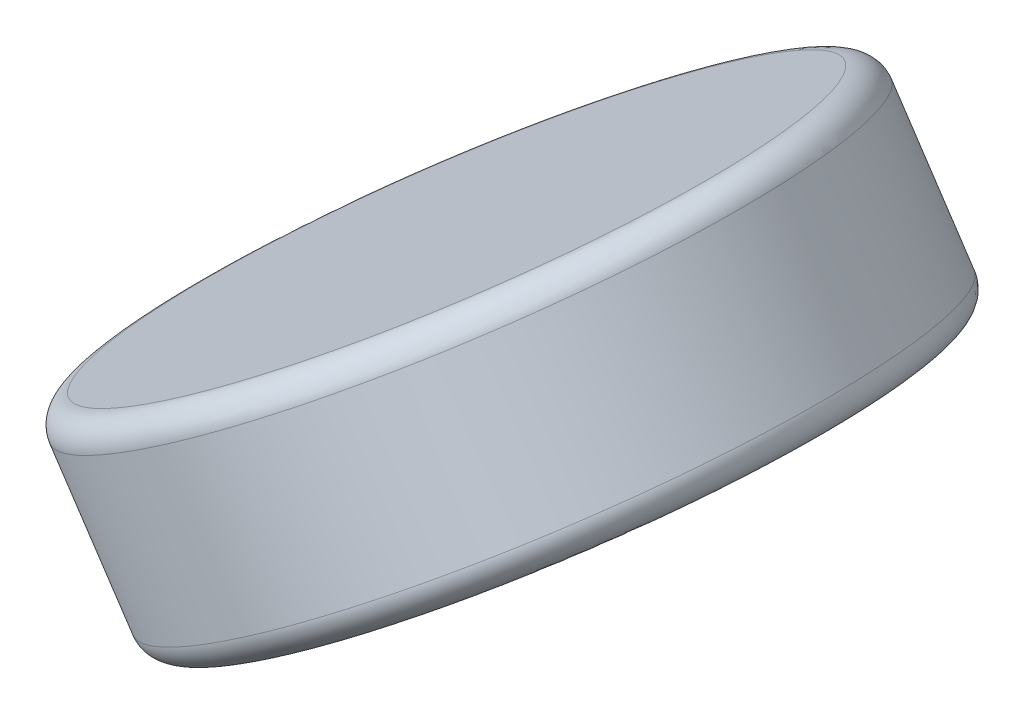
ISO-10303-21;
HEADER;
FILE_DESCRIPTION(('STEP AP214'),'2;1');
FILE_NAME('part.step','',(''),(''),'','','');
FILE_SCHEMA(('AUTOMOTIVE_DESIGN { 1 0 10303 214 1 1 1 1 }'));
ENDSEC;
DATA;
#1=APPLICATION_CONTEXT('core data for automotive mechanical design processes');
#2=APPLICATION_PROTOCOL_DEFINITION('international standard','automotive_design',2000,#1);
#3=PRODUCT_CONTEXT('',#1,'mechanical');
#4=PRODUCT('Part','Part','',(#3));
#5=PRODUCT_RELATED_PRODUCT_CATEGORY('part','',(#4));
#6=PRODUCT_DEFINITION_FORMATION('','',#4);
#7=PRODUCT_DEFINITION_CONTEXT('part definition',#1,'design');
#8=PRODUCT_DEFINITION('design','',#6,#7);
#9=PRODUCT_DEFINITION_SHAPE('','',#8);
#10=(LENGTH_UNIT() NAMED_UNIT(*) SI_UNIT(.MILLI.,.METRE.));
#11=(NAMED_UNIT(*) PLANE_ANGLE_UNIT() SI_UNIT($,.RADIAN.));
#12=(NAMED_UNIT(*) SI_UNIT($,.STERADIAN.) SOLID_ANGLE_UNIT());
#13=UNCERTAINTY_MEASURE_WITH_UNIT(LENGTH_MEASURE(1.E-05),#10,'distance_accuracy_value','');
#14=(GEOMETRIC_REPRESENTATION_CONTEXT(3) GLOBAL_UNCERTAINTY_ASSIGNED_CONTEXT((#13)) GLOBAL_UNIT_ASSIGNED_CONTEXT((#10,
#11,#12)) REPRESENTATION_CONTEXT('',''));
#15=CARTESIAN_POINT('',(0.,0.,0.));
#16=DIRECTION('',(0.,0.,1.));
#17=DIRECTION('',(1.,0.,0.));
#18=AXIS2_PLACEMENT_3D('',#15,#16,#17);
#19=CARTESIAN_POINT('',(71.8171043991235,-5.88355406098562,0.));
#20=DIRECTION('',(-0.555551246362452,0.831482298467698,0.));
#21=DIRECTION('',(-0.831482298467698,-0.555551246362452,0.));
#22=AXIS2_PLACEMENT_3D('',#19,#20,#21);
#23=PLANE('',#22);
#24=CARTESIAN_POINT('',(66.4124694590834,-9.49463716234157,0.));
#25=DIRECTION('',(-0.555551246362452,0.831482298467698,0.));
#26=DIRECTION('',(-0.831482298467698,-0.555551246362452,0.));
#27=AXIS2_PLACEMENT_3D('',#24,#25,#26);
#28=CIRCLE('',#27,6.00000000000001);
#29=CARTESIAN_POINT('',(61.4235756682772,-12.8279446405163,0.));
#30=VERTEX_POINT('',#29);
#31=CARTESIAN_POINT('',(71.4013632498896,-6.16132968416685,0.));
#32=VERTEX_POINT('',#31);
#33=EDGE_CURVE('E42',#30,#32,#28,.T.);
#34=ORIENTED_EDGE('',*,*,#33,.F.);
#35=CARTESIAN_POINT('',(66.4124694590834,-9.49463716234157,0.));
#36=DIRECTION('',(-0.555551246362452,0.831482298467698,0.));
#37=DIRECTION('',(0.831482298467698,0.555551246362451,0.));
#38=AXIS2_PLACEMENT_3D('',#35,#36,#37);
#39=CIRCLE('',#38,6.00000000000002);
#40=EDGE_CURVE('E44',#32,#30,#39,.T.);
#41=ORIENTED_EDGE('',*,*,#40,.F.);
#42=EDGE_LOOP('',(#34,#41));
#43=FACE_BOUND('',#42,.T.);
#44=ADVANCED_FACE('F17',(#43),#23,.F.);
#45=CARTESIAN_POINT('',(66.1346938359022,-9.07889601310772,0.));
#46=DIRECTION('',(-0.555551246362452,0.831482298467698,0.));
#47=DIRECTION('',(-0.831482298467698,-0.555551246362452,0.));
#48=AXIS2_PLACEMENT_3D('',#45,#46,#47);
#49=TOROIDAL_SURFACE('',#48,6.00000000000001,0.5);
#50=ORIENTED_EDGE('',*,*,#33,.T.);
#51=ORIENTED_EDGE('',*,*,#40,.T.);
#52=EDGE_LOOP('',(#50,#51));
#53=FACE_BOUND('',#52,.T.);
#54=CARTESIAN_POINT('',(66.1346938359022,-9.07889601310772,0.));
#55=DIRECTION('',(-0.555551246362452,0.831482298467698,0.));
#56=DIRECTION('',(-0.831482298467698,-0.555551246362452,0.));
#57=AXIS2_PLACEMENT_3D('',#54,#55,#56);
#58=CIRCLE('',#57,6.50000000000002);
#59=CARTESIAN_POINT('',(60.7300588958622,-12.6899791144637,0.));
#60=VERTEX_POINT('',#59);
#61=EDGE_CURVE('E50',#60,#60,#58,.T.);
#62=ORIENTED_EDGE('',*,*,#61,.F.);
#63=EDGE_LOOP('',(#62));
#64=FACE_BOUND('',#63,.T.);
#65=ADVANCED_FACE('F46',(#53,#64),#49,.T.);
#66=CARTESIAN_POINT('',(58.7203402362504,2.01801685146834,0.));
#67=DIRECTION('',(-0.555551246362452,0.831482298467698,0.));
#68=DIRECTION('',(-0.831482298467698,-0.555551246362452,0.));
#69=AXIS2_PLACEMENT_3D('',#66,#67,#68);
#70=CYLINDRICAL_SURFACE('',#69,6.50000000000002);
#71=ORIENTED_EDGE('',*,*,#61,.T.);
#72=EDGE_LOOP('',(#71));
#73=FACE_BOUND('',#72,.T.);
#74=CARTESIAN_POINT('',(64.4680400968148,-6.58444911770462,0.));
#75=DIRECTION('',(0.555551246362452,-0.831482298467698,0.));
#76=DIRECTION('',(0.831482298467698,0.555551246362452,0.));
#77=AXIS2_PLACEMENT_3D('',#74,#75,#76);
#78=CIRCLE('',#77,6.50000000000001);
#79=CARTESIAN_POINT('',(69.8726750368549,-2.97336601634867,0.));
#80=VERTEX_POINT('',#79);
#81=EDGE_CURVE('E112',#80,#80,#78,.F.);
#82=ORIENTED_EDGE('',*,*,#81,.F.);
#83=EDGE_LOOP('',(#82));
#84=FACE_BOUND('',#83,.T.);
#85=ADVANCED_FACE('F76',(#73,#84),#70,.T.);
#86=CARTESIAN_POINT('',(64.4680400968148,-6.58444911770462,0.));
#87=DIRECTION('',(0.555551246362452,-0.831482298467698,0.));
#88=DIRECTION('',(0.831482298467698,0.555551246362452,0.));
#89=AXIS2_PLACEMENT_3D('',#86,#87,#88);
#90=TOROIDAL_SURFACE('',#89,6.00000000000002,0.5);
#91=CARTESIAN_POINT('',(64.1902644736336,-6.16870796847077,0.));
#92=DIRECTION('',(0.555551246362452,-0.831482298467698,0.));
#93=DIRECTION('',(0.831482298467698,0.555551246362452,0.));
#94=AXIS2_PLACEMENT_3D('',#91,#92,#93);
#95=CIRCLE('',#94,6.00000000000002);
#96=CARTESIAN_POINT('',(69.1791582644398,-2.83540049029605,0.));
#97=VERTEX_POINT('',#96);
#98=CARTESIAN_POINT('',(59.2013706828274,-9.50201544664549,0.));
#99=VERTEX_POINT('',#98);
#100=EDGE_CURVE('E28',#97,#99,#95,.T.);
#101=ORIENTED_EDGE('',*,*,#100,.T.);
#102=CARTESIAN_POINT('',(64.1902644736336,-6.16870796847077,0.));
#103=DIRECTION('',(0.555551246362452,-0.831482298467698,0.));
#104=DIRECTION('',(-0.831482298467698,-0.555551246362452,0.));
#105=AXIS2_PLACEMENT_3D('',#102,#103,#104);
#106=CIRCLE('',#105,6.00000000000002);
#107=EDGE_CURVE('E11',#99,#97,#106,.T.);
#108=ORIENTED_EDGE('',*,*,#107,.T.);
#109=EDGE_LOOP('',(#101,#108));
#110=FACE_BOUND('',#109,.T.);
#111=ORIENTED_EDGE('',*,*,#81,.T.);
#112=EDGE_LOOP('',(#111));
#113=FACE_BOUND('',#112,.T.);
#114=ADVANCED_FACE('F91',(#110,#113),#90,.T.);
#115=CARTESIAN_POINT('',(64.1902644736336,-6.16870796847077,0.));
#116=DIRECTION('',(0.555551246362452,-0.831482298467698,0.));
#117=DIRECTION('',(0.831482298467698,0.555551246362452,0.));
#118=AXIS2_PLACEMENT_3D('',#115,#116,#117);
#119=PLANE('',#118);
#120=ORIENTED_EDGE('',*,*,#100,.F.);
#121=ORIENTED_EDGE('',*,*,#107,.F.);
#122=EDGE_LOOP('',(#120,#121));
#123=FACE_BOUND('',#122,.T.);
#124=ADVANCED_FACE('F101',(#123),#119,.F.);
#125=CLOSED_SHELL('',(#44,#65,#85,#114,#124));
#126=MANIFOLD_SOLID_BREP('B1',#125);
#127=ADVANCED_BREP_SHAPE_REPRESENTATION('',(#18,#126),#14);
#128=SHAPE_DEFINITION_REPRESENTATION(#9,#127);
ENDSEC;
END-ISO-10303-21;
